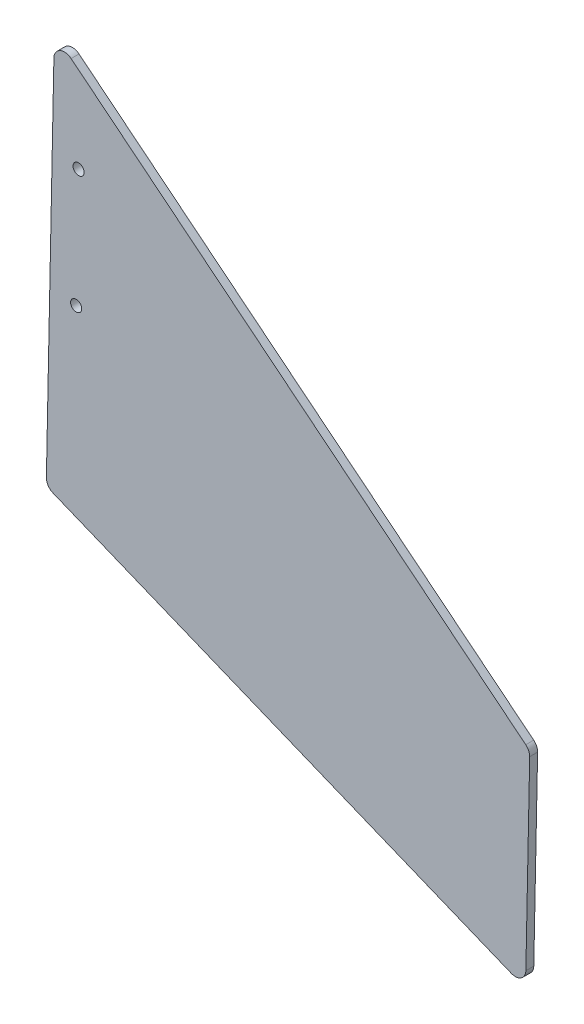
ISO-10303-21;
HEADER;
FILE_DESCRIPTION(('STEP AP214'),'2;1');
FILE_NAME('part.step','',(''),(''),'','','');
FILE_SCHEMA(('AUTOMOTIVE_DESIGN { 1 0 10303 214 1 1 1 1 }'));
ENDSEC;
DATA;
#1=APPLICATION_CONTEXT('core data for automotive mechanical design processes');
#2=APPLICATION_PROTOCOL_DEFINITION('international standard','automotive_design',2000,#1);
#3=PRODUCT_CONTEXT('',#1,'mechanical');
#4=PRODUCT('Part','Part','',(#3));
#5=PRODUCT_RELATED_PRODUCT_CATEGORY('part','',(#4));
#6=PRODUCT_DEFINITION_FORMATION('','',#4);
#7=PRODUCT_DEFINITION_CONTEXT('part definition',#1,'design');
#8=PRODUCT_DEFINITION('design','',#6,#7);
#9=PRODUCT_DEFINITION_SHAPE('','',#8);
#10=(LENGTH_UNIT() NAMED_UNIT(*) SI_UNIT(.MILLI.,.METRE.));
#11=(NAMED_UNIT(*) PLANE_ANGLE_UNIT() SI_UNIT($,.RADIAN.));
#12=(NAMED_UNIT(*) SI_UNIT($,.STERADIAN.) SOLID_ANGLE_UNIT());
#13=UNCERTAINTY_MEASURE_WITH_UNIT(LENGTH_MEASURE(1.E-05),#10,'distance_accuracy_value','');
#14=(GEOMETRIC_REPRESENTATION_CONTEXT(3) GLOBAL_UNCERTAINTY_ASSIGNED_CONTEXT((#13)) GLOBAL_UNIT_ASSIGNED_CONTEXT((#10,
#11,#12)) REPRESENTATION_CONTEXT('',''));
#15=CARTESIAN_POINT('',(0.,0.,0.));
#16=DIRECTION('',(0.,0.,1.));
#17=DIRECTION('',(1.,0.,0.));
#18=AXIS2_PLACEMENT_3D('',#15,#16,#17);
#19=CARTESIAN_POINT('',(178.455758645087,-224.,3.));
#20=DIRECTION('',(-0.999790806275875,0.0204534516948888,0.));
#21=DIRECTION('',(-0.0204534516948888,-0.999790806275875,0.));
#22=AXIS2_PLACEMENT_3D('',#19,#20,#21);
#23=PLANE('',#22);
#24=DIRECTION('',(0.0204534516948888,0.999790806275875,0.));
#25=VECTOR('',#24,1.);
#26=CARTESIAN_POINT('',(178.455758645087,-224.,3.));
#27=LINE('',#26,#25);
#28=CARTESIAN_POINT('',(178.574813412648,-218.180451112785,3.));
#29=VERTEX_POINT('',#28);
#30=CARTESIAN_POINT('',(180.025587190559,-147.264778453809,3.));
#31=VERTEX_POINT('',#30);
#32=EDGE_CURVE('E142',#29,#31,#27,.T.);
#33=ORIENTED_EDGE('',*,*,#32,.F.);
#34=DIRECTION('',(0.,0.,-1.));
#35=VECTOR('',#34,1.);
#36=CARTESIAN_POINT('',(178.574813412648,-218.180451112785,3.));
#37=LINE('',#36,#35);
#38=CARTESIAN_POINT('',(178.574813412648,-218.180451112785,0.));
#39=VERTEX_POINT('',#38);
#40=EDGE_CURVE('E11',#29,#39,#37,.T.);
#41=ORIENTED_EDGE('',*,*,#40,.T.);
#42=DIRECTION('',(0.0204534516948888,0.999790806275875,0.));
#43=VECTOR('',#42,1.);
#44=CARTESIAN_POINT('',(178.455758645087,-224.,0.));
#45=LINE('',#44,#43);
#46=CARTESIAN_POINT('',(180.025587190559,-147.264778453809,0.));
#47=VERTEX_POINT('',#46);
#48=EDGE_CURVE('E188',#39,#47,#45,.T.);
#49=ORIENTED_EDGE('',*,*,#48,.T.);
#50=DIRECTION('',(0.,0.,-1.));
#51=VECTOR('',#50,1.);
#52=CARTESIAN_POINT('',(180.025587190559,-147.264778453809,3.));
#53=LINE('',#52,#51);
#54=EDGE_CURVE('E53',#47,#31,#53,.F.);
#55=ORIENTED_EDGE('',*,*,#54,.T.);
#56=EDGE_LOOP('',(#33,#41,#49,#55));
#57=FACE_BOUND('',#56,.T.);
#58=ADVANCED_FACE('F44',(#57),#23,.F.);
#59=CARTESIAN_POINT('',(180.065729766655,-145.302558134247,3.));
#60=DIRECTION('',(-0.627983554847749,-0.778226608926208,0.));
#61=DIRECTION('',(0.778226608926208,-0.627983554847749,0.));
#62=AXIS2_PLACEMENT_3D('',#59,#60,#61);
#63=PLANE('',#62);
#64=DIRECTION('',(-0.778226608926207,0.627983554847749,0.));
#65=VECTOR('',#64,1.);
#66=CARTESIAN_POINT('',(180.065729766655,-145.302558134247,0.));
#67=LINE('',#66,#65);
#68=CARTESIAN_POINT('',(178.538358184846,-144.070058211324,0.));
#69=VERTEX_POINT('',#68);
#70=CARTESIAN_POINT('',(6.3443543096301,-5.11952447638928,0.));
#71=VERTEX_POINT('',#70);
#72=EDGE_CURVE('E149',#69,#71,#67,.T.);
#73=ORIENTED_EDGE('',*,*,#72,.T.);
#74=DIRECTION('',(0.,0.,-1.));
#75=VECTOR('',#74,1.);
#76=CARTESIAN_POINT('',(6.34435430963004,-5.11952447638922,3.));
#77=LINE('',#76,#75);
#78=CARTESIAN_POINT('',(6.3443543096301,-5.11952447638928,3.));
#79=VERTEX_POINT('',#78);
#80=EDGE_CURVE('E60',#71,#79,#77,.F.);
#81=ORIENTED_EDGE('',*,*,#80,.T.);
#82=DIRECTION('',(-0.778226608926207,0.627983554847749,0.));
#83=VECTOR('',#82,1.);
#84=CARTESIAN_POINT('',(180.065729766655,-145.302558134247,3.));
#85=LINE('',#84,#83);
#86=CARTESIAN_POINT('',(178.538358184846,-144.070058211324,3.));
#87=VERTEX_POINT('',#86);
#88=EDGE_CURVE('E147',#87,#79,#85,.T.);
#89=ORIENTED_EDGE('',*,*,#88,.F.);
#90=DIRECTION('',(0.,0.,-1.));
#91=VECTOR('',#90,1.);
#92=CARTESIAN_POINT('',(178.538358184846,-144.070058211324,3.));
#93=LINE('',#92,#91);
#94=EDGE_CURVE('E177',#87,#69,#93,.T.);
#95=ORIENTED_EDGE('',*,*,#94,.T.);
#96=EDGE_LOOP('',(#73,#81,#89,#95));
#97=FACE_BOUND('',#96,.T.);
#98=ADVANCED_FACE('F195',(#97),#63,.F.);
#99=CARTESIAN_POINT('',(0.,0.,3.));
#100=DIRECTION('',(0.999790806275875,-0.0204534516948889,0.));
#101=DIRECTION('',(0.0204534516948889,0.999790806275875,0.));
#102=AXIS2_PLACEMENT_3D('',#99,#100,#101);
#103=PLANE('',#102);
#104=DIRECTION('',(-0.0204534516948889,-0.999790806275875,0.));
#105=VECTOR('',#104,1.);
#106=CARTESIAN_POINT('',(0.,0.,0.));
#107=LINE('',#106,#105);
#108=CARTESIAN_POINT('',(-0.16674313486444,-8.15061710531453,0.));
#109=VERTEX_POINT('',#108);
#110=CARTESIAN_POINT('',(-3.01243768314587,-147.251796176821,0.));
#111=VERTEX_POINT('',#110);
#112=EDGE_CURVE('E143',#109,#111,#107,.T.);
#113=ORIENTED_EDGE('',*,*,#112,.T.);
#114=DIRECTION('',(0.,0.,-1.));
#115=VECTOR('',#114,1.);
#116=CARTESIAN_POINT('',(-3.01243768314587,-147.251796176821,3.));
#117=LINE('',#116,#115);
#118=CARTESIAN_POINT('',(-3.01243768314587,-147.251796176821,3.));
#119=VERTEX_POINT('',#118);
#120=EDGE_CURVE('E117',#111,#119,#117,.F.);
#121=ORIENTED_EDGE('',*,*,#120,.T.);
#122=DIRECTION('',(-0.0204534516948889,-0.999790806275875,0.));
#123=VECTOR('',#122,1.);
#124=CARTESIAN_POINT('',(0.,0.,3.));
#125=LINE('',#124,#123);
#126=CARTESIAN_POINT('',(-0.16674313486444,-8.15061710531453,3.));
#127=VERTEX_POINT('',#126);
#128=EDGE_CURVE('E203',#127,#119,#125,.T.);
#129=ORIENTED_EDGE('',*,*,#128,.F.);
#130=DIRECTION('',(0.,0.,-1.));
#131=VECTOR('',#130,1.);
#132=CARTESIAN_POINT('',(-0.16674313486444,-8.15061710531453,3.));
#133=LINE('',#132,#131);
#134=EDGE_CURVE('E123',#127,#109,#133,.T.);
#135=ORIENTED_EDGE('',*,*,#134,.T.);
#136=EDGE_LOOP('',(#113,#121,#129,#135));
#137=FACE_BOUND('',#136,.T.);
#138=ADVANCED_FACE('F251',(#137),#103,.F.);
#139=CARTESIAN_POINT('',(-3.06865969858375,-150.,3.));
#140=DIRECTION('',(0.37749641603102,0.92601104522772,0.));
#141=DIRECTION('',(-0.926011045227721,0.37749641603102,0.));
#142=AXIS2_PLACEMENT_3D('',#139,#140,#141);
#143=PLANE('',#142);
#144=DIRECTION('',(0.92601104522772,-0.37749641603102,0.));
#145=VECTOR('',#144,1.);
#146=CARTESIAN_POINT('',(-3.06865969858375,-150.,3.));
#147=LINE('',#146,#145);
#148=CARTESIAN_POINT('',(-0.523260122166441,-151.037654164512,3.));
#149=VERTEX_POINT('',#148);
#150=CARTESIAN_POINT('',(173.065664523421,-221.802681486916,3.));
#151=VERTEX_POINT('',#150);
#152=EDGE_CURVE('E133',#149,#151,#147,.T.);
#153=ORIENTED_EDGE('',*,*,#152,.F.);
#154=DIRECTION('',(0.,0.,-1.));
#155=VECTOR('',#154,1.);
#156=CARTESIAN_POINT('',(-0.523260122166442,-151.037654164512,3.));
#157=LINE('',#156,#155);
#158=CARTESIAN_POINT('',(-0.523260122166441,-151.037654164512,0.));
#159=VERTEX_POINT('',#158);
#160=EDGE_CURVE('E116',#149,#159,#157,.T.);
#161=ORIENTED_EDGE('',*,*,#160,.T.);
#162=DIRECTION('',(0.92601104522772,-0.37749641603102,0.));
#163=VECTOR('',#162,1.);
#164=CARTESIAN_POINT('',(-3.06865969858375,-150.,0.));
#165=LINE('',#164,#163);
#166=CARTESIAN_POINT('',(173.065664523421,-221.802681486916,0.));
#167=VERTEX_POINT('',#166);
#168=EDGE_CURVE('E130',#159,#167,#165,.T.);
#169=ORIENTED_EDGE('',*,*,#168,.T.);
#170=DIRECTION('',(0.,0.,-1.));
#171=VECTOR('',#170,1.);
#172=CARTESIAN_POINT('',(173.065664523421,-221.802681486916,3.));
#173=LINE('',#172,#171);
#174=EDGE_CURVE('E136',#167,#151,#173,.F.);
#175=ORIENTED_EDGE('',*,*,#174,.T.);
#176=EDGE_LOOP('',(#153,#161,#169,#175));
#177=FACE_BOUND('',#176,.T.);
#178=ADVANCED_FACE('F129',(#177),#143,.F.);
#179=CARTESIAN_POINT('',(0.,0.,3.));
#180=DIRECTION('',(0.,0.,-1.));
#181=DIRECTION('',(-1.,0.,0.));
#182=AXIS2_PLACEMENT_3D('',#179,#180,#181);
#183=PLANE('',#182);
#184=CARTESIAN_POINT('',(9.18378312199729,-40.,3.));
#185=DIRECTION('',(0.,0.,1.));
#186=DIRECTION('',(1.,0.,0.));
#187=AXIS2_PLACEMENT_3D('',#184,#185,#186);
#188=CIRCLE('',#187,2.1);
#189=CARTESIAN_POINT('',(11.2837831219973,-40.,3.));
#190=VERTEX_POINT('',#189);
#191=EDGE_CURVE('E216',#190,#190,#188,.T.);
#192=ORIENTED_EDGE('',*,*,#191,.F.);
#193=EDGE_LOOP('',(#192));
#194=FACE_BOUND('',#193,.T.);
#195=CARTESIAN_POINT('',(8.25928710538831,-85.1905444436696,3.));
#196=DIRECTION('',(0.,0.,1.));
#197=DIRECTION('',(1.,0.,0.));
#198=AXIS2_PLACEMENT_3D('',#195,#196,#197);
#199=CIRCLE('',#198,2.1);
#200=CARTESIAN_POINT('',(10.3592871053883,-85.1905444436696,3.));
#201=VERTEX_POINT('',#200);
#202=EDGE_CURVE('E212',#201,#201,#199,.T.);
#203=ORIENTED_EDGE('',*,*,#202,.F.);
#204=EDGE_LOOP('',(#203));
#205=FACE_BOUND('',#204,.T.);
#206=ORIENTED_EDGE('',*,*,#128,.T.);
#207=CARTESIAN_POINT('',(0.986725541957636,-147.333609983601,3.));
#208=DIRECTION('',(0.,0.,-1.));
#209=DIRECTION('',(-1.,0.,0.));
#210=AXIS2_PLACEMENT_3D('',#207,#208,#209);
#211=CIRCLE('',#210,4.);
#212=EDGE_CURVE('E174',#119,#149,#211,.F.);
#213=ORIENTED_EDGE('',*,*,#212,.T.);
#214=ORIENTED_EDGE('',*,*,#152,.T.);
#215=CARTESIAN_POINT('',(174.575650187545,-218.098637306005,3.));
#216=DIRECTION('',(0.,0.,-1.));
#217=DIRECTION('',(-1.,0.,0.));
#218=AXIS2_PLACEMENT_3D('',#215,#216,#217);
#219=CIRCLE('',#218,4.);
#220=EDGE_CURVE('E168',#151,#29,#219,.F.);
#221=ORIENTED_EDGE('',*,*,#220,.T.);
#222=ORIENTED_EDGE('',*,*,#32,.T.);
#223=CARTESIAN_POINT('',(176.026423965455,-147.182964647029,3.));
#224=DIRECTION('',(0.,0.,-1.));
#225=DIRECTION('',(-1.,0.,0.));
#226=AXIS2_PLACEMENT_3D('',#223,#224,#225);
#227=CIRCLE('',#226,4.);
#228=EDGE_CURVE('E67',#31,#87,#227,.F.);
#229=ORIENTED_EDGE('',*,*,#228,.T.);
#230=ORIENTED_EDGE('',*,*,#88,.T.);
#231=CARTESIAN_POINT('',(3.83242009023906,-8.23243091209408,3.));
#232=DIRECTION('',(0.,0.,-1.));
#233=DIRECTION('',(-1.,0.,0.));
#234=AXIS2_PLACEMENT_3D('',#231,#232,#233);
#235=CIRCLE('',#234,4.);
#236=EDGE_CURVE('E171',#79,#127,#235,.F.);
#237=ORIENTED_EDGE('',*,*,#236,.T.);
#238=EDGE_LOOP('',(#206,#213,#214,#221,#222,#229,#230,#237));
#239=FACE_BOUND('',#238,.T.);
#240=ADVANCED_FACE('F191',(#194,#205,#239),#183,.F.);
#241=CARTESIAN_POINT('',(0.,0.,0.));
#242=DIRECTION('',(0.,0.,-1.));
#243=DIRECTION('',(-1.,0.,0.));
#244=AXIS2_PLACEMENT_3D('',#241,#242,#243);
#245=PLANE('',#244);
#246=CARTESIAN_POINT('',(9.18378312199729,-40.,0.));
#247=DIRECTION('',(0.,0.,1.));
#248=DIRECTION('',(1.,0.,0.));
#249=AXIS2_PLACEMENT_3D('',#246,#247,#248);
#250=CIRCLE('',#249,2.1);
#251=CARTESIAN_POINT('',(11.2837831219973,-40.,0.));
#252=VERTEX_POINT('',#251);
#253=EDGE_CURVE('E198',#252,#252,#250,.T.);
#254=ORIENTED_EDGE('',*,*,#253,.T.);
#255=EDGE_LOOP('',(#254));
#256=FACE_BOUND('',#255,.T.);
#257=CARTESIAN_POINT('',(8.25928710538831,-85.1905444436696,0.));
#258=DIRECTION('',(0.,0.,1.));
#259=DIRECTION('',(1.,0.,0.));
#260=AXIS2_PLACEMENT_3D('',#257,#258,#259);
#261=CIRCLE('',#260,2.1);
#262=CARTESIAN_POINT('',(10.3592871053883,-85.1905444436696,0.));
#263=VERTEX_POINT('',#262);
#264=EDGE_CURVE('E208',#263,#263,#261,.T.);
#265=ORIENTED_EDGE('',*,*,#264,.T.);
#266=EDGE_LOOP('',(#265));
#267=FACE_BOUND('',#266,.T.);
#268=ORIENTED_EDGE('',*,*,#168,.F.);
#269=CARTESIAN_POINT('',(0.986725541957636,-147.333609983601,0.));
#270=DIRECTION('',(0.,0.,-1.));
#271=DIRECTION('',(-1.,0.,0.));
#272=AXIS2_PLACEMENT_3D('',#269,#270,#271);
#273=CIRCLE('',#272,4.);
#274=EDGE_CURVE('E112',#159,#111,#273,.T.);
#275=ORIENTED_EDGE('',*,*,#274,.T.);
#276=ORIENTED_EDGE('',*,*,#112,.F.);
#277=CARTESIAN_POINT('',(3.83242009023906,-8.23243091209408,0.));
#278=DIRECTION('',(0.,0.,-1.));
#279=DIRECTION('',(-1.,0.,0.));
#280=AXIS2_PLACEMENT_3D('',#277,#278,#279);
#281=CIRCLE('',#280,4.);
#282=EDGE_CURVE('E124',#109,#71,#281,.T.);
#283=ORIENTED_EDGE('',*,*,#282,.T.);
#284=ORIENTED_EDGE('',*,*,#72,.F.);
#285=CARTESIAN_POINT('',(176.026423965455,-147.182964647029,0.));
#286=DIRECTION('',(0.,0.,-1.));
#287=DIRECTION('',(-1.,0.,0.));
#288=AXIS2_PLACEMENT_3D('',#285,#286,#287);
#289=CIRCLE('',#288,4.);
#290=EDGE_CURVE('E135',#69,#47,#289,.T.);
#291=ORIENTED_EDGE('',*,*,#290,.T.);
#292=ORIENTED_EDGE('',*,*,#48,.F.);
#293=CARTESIAN_POINT('',(174.575650187545,-218.098637306005,0.));
#294=DIRECTION('',(0.,0.,-1.));
#295=DIRECTION('',(-1.,0.,0.));
#296=AXIS2_PLACEMENT_3D('',#293,#294,#295);
#297=CIRCLE('',#296,4.);
#298=EDGE_CURVE('E140',#39,#167,#297,.T.);
#299=ORIENTED_EDGE('',*,*,#298,.T.);
#300=EDGE_LOOP('',(#268,#275,#276,#283,#284,#291,#292,#299));
#301=FACE_BOUND('',#300,.T.);
#302=ADVANCED_FACE('F138',(#256,#267,#301),#245,.T.);
#303=CARTESIAN_POINT('',(0.986725541957636,-147.333609983601,3.));
#304=DIRECTION('',(0.,0.,-1.));
#305=DIRECTION('',(-1.,0.,0.));
#306=AXIS2_PLACEMENT_3D('',#303,#304,#305);
#307=CYLINDRICAL_SURFACE('',#306,4.);
#308=ORIENTED_EDGE('',*,*,#212,.F.);
#309=ORIENTED_EDGE('',*,*,#120,.F.);
#310=ORIENTED_EDGE('',*,*,#274,.F.);
#311=ORIENTED_EDGE('',*,*,#160,.F.);
#312=EDGE_LOOP('',(#308,#309,#310,#311));
#313=FACE_BOUND('',#312,.T.);
#314=ADVANCED_FACE('F115',(#313),#307,.T.);
#315=CARTESIAN_POINT('',(3.83242009023906,-8.23243091209408,3.));
#316=DIRECTION('',(0.,0.,-1.));
#317=DIRECTION('',(-1.,0.,0.));
#318=AXIS2_PLACEMENT_3D('',#315,#316,#317);
#319=CYLINDRICAL_SURFACE('',#318,4.);
#320=ORIENTED_EDGE('',*,*,#236,.F.);
#321=ORIENTED_EDGE('',*,*,#80,.F.);
#322=ORIENTED_EDGE('',*,*,#282,.F.);
#323=ORIENTED_EDGE('',*,*,#134,.F.);
#324=EDGE_LOOP('',(#320,#321,#322,#323));
#325=FACE_BOUND('',#324,.T.);
#326=ADVANCED_FACE('F257',(#325),#319,.T.);
#327=CARTESIAN_POINT('',(174.575650187545,-218.098637306005,3.));
#328=DIRECTION('',(0.,0.,-1.));
#329=DIRECTION('',(-1.,0.,0.));
#330=AXIS2_PLACEMENT_3D('',#327,#328,#329);
#331=CYLINDRICAL_SURFACE('',#330,4.);
#332=ORIENTED_EDGE('',*,*,#220,.F.);
#333=ORIENTED_EDGE('',*,*,#174,.F.);
#334=ORIENTED_EDGE('',*,*,#298,.F.);
#335=ORIENTED_EDGE('',*,*,#40,.F.);
#336=EDGE_LOOP('',(#332,#333,#334,#335));
#337=FACE_BOUND('',#336,.T.);
#338=ADVANCED_FACE('F244',(#337),#331,.T.);
#339=CARTESIAN_POINT('',(176.026423965455,-147.182964647029,3.));
#340=DIRECTION('',(0.,0.,-1.));
#341=DIRECTION('',(-1.,0.,0.));
#342=AXIS2_PLACEMENT_3D('',#339,#340,#341);
#343=CYLINDRICAL_SURFACE('',#342,4.);
#344=ORIENTED_EDGE('',*,*,#228,.F.);
#345=ORIENTED_EDGE('',*,*,#54,.F.);
#346=ORIENTED_EDGE('',*,*,#290,.F.);
#347=ORIENTED_EDGE('',*,*,#94,.F.);
#348=EDGE_LOOP('',(#344,#345,#346,#347));
#349=FACE_BOUND('',#348,.T.);
#350=ADVANCED_FACE('F46',(#349),#343,.T.);
#351=CARTESIAN_POINT('',(8.25928710538831,-85.1905444436696,0.));
#352=DIRECTION('',(0.,0.,1.));
#353=DIRECTION('',(1.,0.,0.));
#354=AXIS2_PLACEMENT_3D('',#351,#352,#353);
#355=CYLINDRICAL_SURFACE('',#354,2.1);
#356=ORIENTED_EDGE('',*,*,#264,.F.);
#357=EDGE_LOOP('',(#356));
#358=FACE_BOUND('',#357,.T.);
#359=ORIENTED_EDGE('',*,*,#202,.T.);
#360=EDGE_LOOP('',(#359));
#361=FACE_BOUND('',#360,.T.);
#362=ADVANCED_FACE('F229',(#358,#361),#355,.F.);
#363=CARTESIAN_POINT('',(9.18378312199729,-40.,0.));
#364=DIRECTION('',(0.,0.,1.));
#365=DIRECTION('',(1.,0.,0.));
#366=AXIS2_PLACEMENT_3D('',#363,#364,#365);
#367=CYLINDRICAL_SURFACE('',#366,2.1);
#368=ORIENTED_EDGE('',*,*,#253,.F.);
#369=EDGE_LOOP('',(#368));
#370=FACE_BOUND('',#369,.T.);
#371=ORIENTED_EDGE('',*,*,#191,.T.);
#372=EDGE_LOOP('',(#371));
#373=FACE_BOUND('',#372,.T.);
#374=ADVANCED_FACE('F226',(#370,#373),#367,.F.);
#375=CLOSED_SHELL('',(#58,#98,#138,#178,#240,#302,#314,#326,#338,#350,#362,#374));
#376=MANIFOLD_SOLID_BREP('B2',#375);
#377=ADVANCED_BREP_SHAPE_REPRESENTATION('',(#18,#376),#14);
#378=SHAPE_DEFINITION_REPRESENTATION(#9,#377);
ENDSEC;
END-ISO-10303-21;
